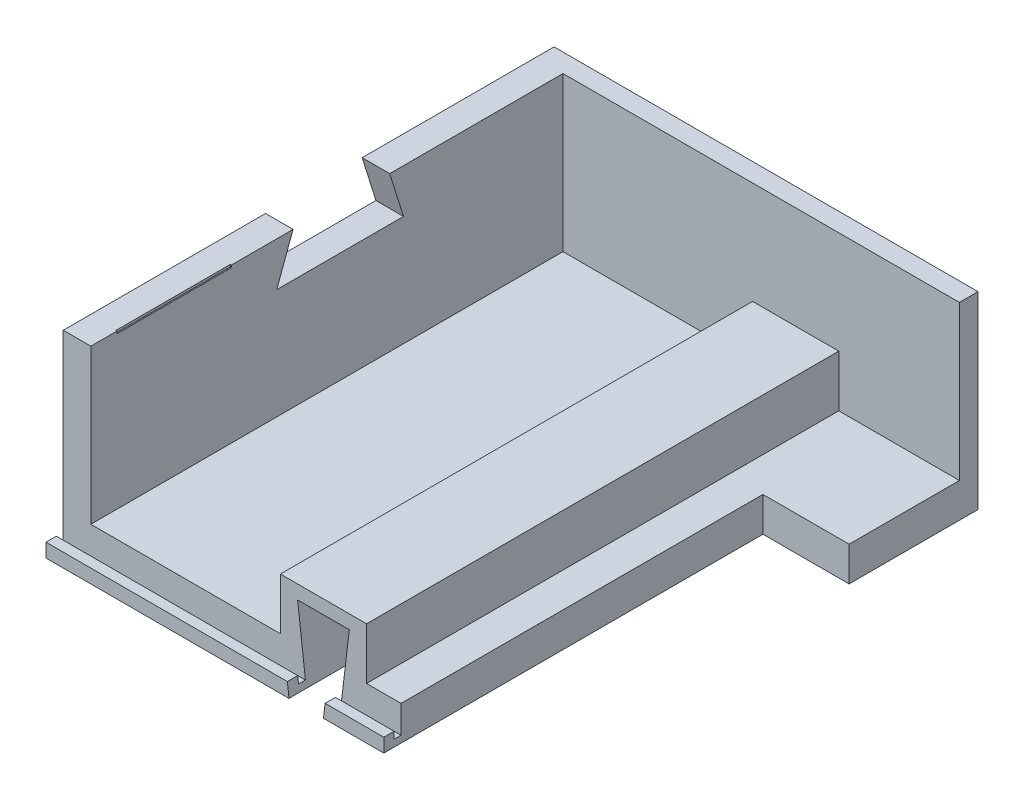
ISO-10303-21;
HEADER;
FILE_DESCRIPTION(('STEP AP214'),'2;1');
FILE_NAME('part.step','',(''),(''),'','','');
FILE_SCHEMA(('AUTOMOTIVE_DESIGN { 1 0 10303 214 1 1 1 1 }'));
ENDSEC;
DATA;
#1=APPLICATION_CONTEXT('core data for automotive mechanical design processes');
#2=APPLICATION_PROTOCOL_DEFINITION('international standard','automotive_design',2000,#1);
#3=PRODUCT_CONTEXT('',#1,'mechanical');
#4=PRODUCT('Part','Part','',(#3));
#5=PRODUCT_RELATED_PRODUCT_CATEGORY('part','',(#4));
#6=PRODUCT_DEFINITION_FORMATION('','',#4);
#7=PRODUCT_DEFINITION_CONTEXT('part definition',#1,'design');
#8=PRODUCT_DEFINITION('design','',#6,#7);
#9=PRODUCT_DEFINITION_SHAPE('','',#8);
#10=(LENGTH_UNIT() NAMED_UNIT(*) SI_UNIT(.MILLI.,.METRE.));
#11=(NAMED_UNIT(*) PLANE_ANGLE_UNIT() SI_UNIT($,.RADIAN.));
#12=(NAMED_UNIT(*) SI_UNIT($,.STERADIAN.) SOLID_ANGLE_UNIT());
#13=UNCERTAINTY_MEASURE_WITH_UNIT(LENGTH_MEASURE(1.E-05),#10,'distance_accuracy_value','');
#14=(GEOMETRIC_REPRESENTATION_CONTEXT(3) GLOBAL_UNCERTAINTY_ASSIGNED_CONTEXT((#13)) GLOBAL_UNIT_ASSIGNED_CONTEXT((#10,
#11,#12)) REPRESENTATION_CONTEXT('',''));
#15=CARTESIAN_POINT('',(0.,0.,0.));
#16=DIRECTION('',(0.,0.,1.));
#17=DIRECTION('',(1.,0.,0.));
#18=AXIS2_PLACEMENT_3D('',#15,#16,#17);
#19=CARTESIAN_POINT('',(21.4354854809113,-45.2491025304259,-73.0388494877858));
#20=DIRECTION('',(0.,-1.,0.));
#21=DIRECTION('',(1.,0.,0.));
#22=AXIS2_PLACEMENT_3D('',#19,#20,#21);
#23=PLANE('',#22);
#24=DIRECTION('',(-1.,0.,0.));
#25=VECTOR('',#24,1.);
#26=CARTESIAN_POINT('',(-125.,-45.2491025304259,-67.));
#27=LINE('',#26,#25);
#28=CARTESIAN_POINT('',(0.,-45.2491025304259,-67.));
#29=VERTEX_POINT('',#28);
#30=CARTESIAN_POINT('',(-115.,-45.2491025304259,-67.));
#31=VERTEX_POINT('',#30);
#32=EDGE_CURVE('E406',#29,#31,#27,.T.);
#33=ORIENTED_EDGE('',*,*,#32,.F.);
#34=DIRECTION('',(0.,0.,1.));
#35=VECTOR('',#34,1.);
#36=CARTESIAN_POINT('',(0.,-45.2491025304259,-81.3471847648053));
#37=LINE('',#36,#35);
#38=CARTESIAN_POINT('',(0.,-45.2491025304259,-72.4000000000001));
#39=VERTEX_POINT('',#38);
#40=EDGE_CURVE('E270',#39,#29,#37,.T.);
#41=ORIENTED_EDGE('',*,*,#40,.F.);
#42=DIRECTION('',(1.,0.,0.));
#43=VECTOR('',#42,1.);
#44=CARTESIAN_POINT('',(-265.,-45.2491025304259,-72.4000000000001));
#45=LINE('',#44,#43);
#46=CARTESIAN_POINT('',(-123.,-45.2491025304259,-72.4000000000001));
#47=VERTEX_POINT('',#46);
#48=EDGE_CURVE('E377',#47,#39,#45,.T.);
#49=ORIENTED_EDGE('',*,*,#48,.F.);
#50=DIRECTION('',(0.,0.,-1.));
#51=VECTOR('',#50,1.);
#52=CARTESIAN_POINT('',(-123.,-45.2491025304259,-313.));
#53=LINE('',#52,#51);
#54=CARTESIAN_POINT('',(-123.,-45.2491025304259,-16.7215392697663));
#55=VERTEX_POINT('',#54);
#56=EDGE_CURVE('E404',#55,#47,#53,.T.);
#57=ORIENTED_EDGE('',*,*,#56,.F.);
#58=DIRECTION('',(-1.,0.,0.));
#59=VECTOR('',#58,1.);
#60=CARTESIAN_POINT('',(21.4354854809113,-45.2491025304259,-16.7215392697663));
#61=LINE('',#60,#59);
#62=CARTESIAN_POINT('',(-115.,-45.2491025304259,-16.7215392697663));
#63=VERTEX_POINT('',#62);
#64=EDGE_CURVE('E414',#63,#55,#61,.T.);
#65=ORIENTED_EDGE('',*,*,#64,.F.);
#66=DIRECTION('',(0.,0.,1.));
#67=VECTOR('',#66,1.);
#68=CARTESIAN_POINT('',(-115.,-45.2491025304259,0.));
#69=LINE('',#68,#67);
#70=EDGE_CURVE('E421',#31,#63,#69,.T.);
#71=ORIENTED_EDGE('',*,*,#70,.F.);
#72=EDGE_LOOP('',(#33,#41,#49,#57,#65,#71));
#73=FACE_BOUND('',#72,.T.);
#74=ADVANCED_FACE('F35',(#73),#23,.F.);
#75=CARTESIAN_POINT('',(21.4354854809113,-45.2491025304259,11.3119662609812));
#76=DIRECTION('',(0.,-1.,0.));
#77=DIRECTION('',(1.,0.,0.));
#78=AXIS2_PLACEMENT_3D('',#75,#76,#77);
#79=PLANE('',#78);
#80=DIRECTION('',(-1.,0.,0.));
#81=VECTOR('',#80,1.);
#82=CARTESIAN_POINT('',(21.4354854809113,-45.2491025304259,11.3119662609812));
#83=LINE('',#82,#81);
#84=CARTESIAN_POINT('',(-115.,-45.2491025304259,11.3119662609812));
#85=VERTEX_POINT('',#84);
#86=CARTESIAN_POINT('',(-123.,-45.2491025304259,11.3119662609812));
#87=VERTEX_POINT('',#86);
#88=EDGE_CURVE('E11',#85,#87,#83,.T.);
#89=ORIENTED_EDGE('',*,*,#88,.T.);
#90=DIRECTION('',(0.,0.,-1.));
#91=VECTOR('',#90,1.);
#92=CARTESIAN_POINT('',(-123.,-45.2491025304259,-313.));
#93=LINE('',#92,#91);
#94=CARTESIAN_POINT('',(-123.,-45.2491025304259,70.));
#95=VERTEX_POINT('',#94);
#96=EDGE_CURVE('E51',#95,#87,#93,.T.);
#97=ORIENTED_EDGE('',*,*,#96,.F.);
#98=DIRECTION('',(-1.,0.,0.));
#99=VECTOR('',#98,1.);
#100=CARTESIAN_POINT('',(123.,-45.2491025304259,70.));
#101=LINE('',#100,#99);
#102=CARTESIAN_POINT('',(-115.,-45.2491025304259,70.));
#103=VERTEX_POINT('',#102);
#104=EDGE_CURVE('E407',#103,#95,#101,.T.);
#105=ORIENTED_EDGE('',*,*,#104,.F.);
#106=DIRECTION('',(0.,0.,1.));
#107=VECTOR('',#106,1.);
#108=CARTESIAN_POINT('',(-115.,-45.2491025304259,0.));
#109=LINE('',#108,#107);
#110=CARTESIAN_POINT('',(-115.,-45.2491025304259,62.3767432768174));
#111=VERTEX_POINT('',#110);
#112=EDGE_CURVE('E408',#111,#103,#109,.T.);
#113=ORIENTED_EDGE('',*,*,#112,.F.);
#114=DIRECTION('',(1.,0.,0.));
#115=VECTOR('',#114,1.);
#116=CARTESIAN_POINT('',(-115.313326688061,-45.2491025304259,62.3767432768174));
#117=LINE('',#116,#115);
#118=CARTESIAN_POINT('',(-115.313326688061,-45.2491025304259,62.3767432768174));
#119=VERTEX_POINT('',#118);
#120=EDGE_CURVE('E423',#119,#111,#117,.T.);
#121=ORIENTED_EDGE('',*,*,#120,.F.);
#122=DIRECTION('',(0.,0.,-1.));
#123=VECTOR('',#122,1.);
#124=CARTESIAN_POINT('',(-115.313326688061,-45.2491025304259,0.));
#125=LINE('',#124,#123);
#126=CARTESIAN_POINT('',(-115.313326688061,-45.2491025304259,29.2279597068515));
#127=VERTEX_POINT('',#126);
#128=EDGE_CURVE('E417',#119,#127,#125,.T.);
#129=ORIENTED_EDGE('',*,*,#128,.T.);
#130=DIRECTION('',(-1.,0.,0.));
#131=VECTOR('',#130,1.);
#132=CARTESIAN_POINT('',(-115.313326688061,-45.2491025304259,29.2279597068515));
#133=LINE('',#132,#131);
#134=CARTESIAN_POINT('',(-115.,-45.2491025304259,29.2279597068515));
#135=VERTEX_POINT('',#134);
#136=EDGE_CURVE('E419',#135,#127,#133,.T.);
#137=ORIENTED_EDGE('',*,*,#136,.F.);
#138=EDGE_CURVE('E424',#85,#135,#109,.T.);
#139=ORIENTED_EDGE('',*,*,#138,.F.);
#140=EDGE_LOOP('',(#89,#97,#105,#113,#121,#129,#137,#139));
#141=FACE_BOUND('',#140,.T.);
#142=ADVANCED_FACE('F457',(#141),#79,.F.);
#143=CARTESIAN_POINT('',(21.4354854809113,-58.014359513177,16.0676502349473));
#144=DIRECTION('',(0.,0.349109023172947,0.937082114832649));
#145=DIRECTION('',(0.,-0.93708211483265,0.349109023172947));
#146=AXIS2_PLACEMENT_3D('',#143,#144,#145);
#147=PLANE('',#146);
#148=DIRECTION('',(-1.,0.,0.));
#149=VECTOR('',#148,1.);
#150=CARTESIAN_POINT('',(21.4354854809113,-58.014359513177,16.0676502349473));
#151=LINE('',#150,#149);
#152=CARTESIAN_POINT('',(-115.,-58.014359513177,16.0676502349473));
#153=VERTEX_POINT('',#152);
#154=CARTESIAN_POINT('',(-123.,-58.014359513177,16.0676502349473));
#155=VERTEX_POINT('',#154);
#156=EDGE_CURVE('E43',#153,#155,#151,.T.);
#157=ORIENTED_EDGE('',*,*,#156,.T.);
#158=DIRECTION('',(0.,-0.937082114832649,0.349109023172947));
#159=VECTOR('',#158,1.);
#160=CARTESIAN_POINT('',(-123.,107.606809349563,-45.6343538511715));
#161=LINE('',#160,#159);
#162=EDGE_CURVE('E55',#87,#155,#161,.T.);
#163=ORIENTED_EDGE('',*,*,#162,.F.);
#164=ORIENTED_EDGE('',*,*,#88,.F.);
#165=DIRECTION('',(0.,0.93708211483265,-0.349109023172947));
#166=VECTOR('',#165,1.);
#167=CARTESIAN_POINT('',(-115.,-1.81418997521706,-4.86966782821422));
#168=LINE('',#167,#166);
#169=EDGE_CURVE('E426',#153,#85,#168,.T.);
#170=ORIENTED_EDGE('',*,*,#169,.F.);
#171=EDGE_LOOP('',(#157,#163,#164,#170));
#172=FACE_BOUND('',#171,.T.);
#173=ADVANCED_FACE('F449',(#172),#147,.F.);
#174=CARTESIAN_POINT('',(21.4354854809113,-58.014359513177,-20.7263257741588));
#175=DIRECTION('',(0.,-1.,0.));
#176=DIRECTION('',(1.,0.,0.));
#177=AXIS2_PLACEMENT_3D('',#174,#175,#176);
#178=PLANE('',#177);
#179=DIRECTION('',(-1.,0.,0.));
#180=VECTOR('',#179,1.);
#181=CARTESIAN_POINT('',(21.4354854809113,-58.014359513177,-20.7263257741588));
#182=LINE('',#181,#180);
#183=CARTESIAN_POINT('',(-115.,-58.014359513177,-20.7263257741588));
#184=VERTEX_POINT('',#183);
#185=CARTESIAN_POINT('',(-123.,-58.014359513177,-20.7263257741588));
#186=VERTEX_POINT('',#185);
#187=EDGE_CURVE('E411',#184,#186,#182,.T.);
#188=ORIENTED_EDGE('',*,*,#187,.T.);
#189=DIRECTION('',(0.,0.,-1.));
#190=VECTOR('',#189,1.);
#191=CARTESIAN_POINT('',(-123.,-58.014359513177,-313.));
#192=LINE('',#191,#190);
#193=EDGE_CURVE('E399',#155,#186,#192,.T.);
#194=ORIENTED_EDGE('',*,*,#193,.F.);
#195=ORIENTED_EDGE('',*,*,#156,.F.);
#196=DIRECTION('',(0.,0.,1.));
#197=VECTOR('',#196,1.);
#198=CARTESIAN_POINT('',(-115.,-58.014359513177,0.));
#199=LINE('',#198,#197);
#200=EDGE_CURVE('E432',#184,#153,#199,.T.);
#201=ORIENTED_EDGE('',*,*,#200,.F.);
#202=EDGE_LOOP('',(#188,#194,#195,#201));
#203=FACE_BOUND('',#202,.T.);
#204=ADVANCED_FACE('F447',(#203),#178,.F.);
#205=CARTESIAN_POINT('',(21.4354854809113,-45.2491025304259,-16.7215392697663));
#206=DIRECTION('',(0.,0.299340074537326,-0.954146487587723));
#207=DIRECTION('',(0.,0.954146487587723,0.299340074537326));
#208=AXIS2_PLACEMENT_3D('',#205,#206,#207);
#209=PLANE('',#208);
#210=ORIENTED_EDGE('',*,*,#64,.T.);
#211=DIRECTION('',(0.,0.954146487587723,0.299340074537326));
#212=VECTOR('',#211,1.);
#213=CARTESIAN_POINT('',(-123.,-81.3927176071615,-28.0607126271736));
#214=LINE('',#213,#212);
#215=EDGE_CURVE('E401',#186,#55,#214,.T.);
#216=ORIENTED_EDGE('',*,*,#215,.F.);
#217=ORIENTED_EDGE('',*,*,#187,.F.);
#218=DIRECTION('',(0.,-0.954146487587723,-0.299340074537326));
#219=VECTOR('',#218,1.);
#220=CARTESIAN_POINT('',(-115.,0.721388098123992,-2.29942456277022));
#221=LINE('',#220,#219);
#222=EDGE_CURVE('E38',#63,#184,#221,.T.);
#223=ORIENTED_EDGE('',*,*,#222,.F.);
#224=EDGE_LOOP('',(#210,#216,#217,#223));
#225=FACE_BOUND('',#224,.T.);
#226=ADVANCED_FACE('F444',(#225),#209,.F.);
#227=CARTESIAN_POINT('',(123.,0.,72.));
#228=DIRECTION('',(0.,0.,-1.));
#229=DIRECTION('',(-1.,0.,0.));
#230=AXIS2_PLACEMENT_3D('',#227,#228,#229);
#231=PLANE('',#230);
#232=DIRECTION('',(-1.,0.,0.));
#233=VECTOR('',#232,1.);
#234=CARTESIAN_POINT('',(123.,-96.,72.));
#235=LINE('',#234,#233);
#236=CARTESIAN_POINT('',(-25.,-96.,72.));
#237=VERTEX_POINT('',#236);
#238=CARTESIAN_POINT('',(-42.0238095238096,-96.,72.));
#239=VERTEX_POINT('',#238);
#240=EDGE_CURVE('E385',#237,#239,#235,.T.);
#241=ORIENTED_EDGE('',*,*,#240,.F.);
#242=DIRECTION('',(0.,-1.,0.));
#243=VECTOR('',#242,1.);
#244=CARTESIAN_POINT('',(-25.,-26.0000000000001,72.));
#245=LINE('',#244,#243);
#246=CARTESIAN_POINT('',(-25.,-98.,72.));
#247=VERTEX_POINT('',#246);
#248=EDGE_CURVE('E323',#237,#247,#245,.T.);
#249=ORIENTED_EDGE('',*,*,#248,.T.);
#250=DIRECTION('',(-1.,0.,0.));
#251=VECTOR('',#250,1.);
#252=CARTESIAN_POINT('',(123.,-98.,72.));
#253=LINE('',#252,#251);
#254=CARTESIAN_POINT('',(-42.2619047619048,-98.,72.));
#255=VERTEX_POINT('',#254);
#256=EDGE_CURVE('E364',#247,#255,#253,.T.);
#257=ORIENTED_EDGE('',*,*,#256,.T.);
#258=DIRECTION('',(-0.118212889785112,-0.992988274194944,0.));
#259=VECTOR('',#258,1.);
#260=CARTESIAN_POINT('',(-30.1676914477362,3.59139183901622,72.));
#261=LINE('',#260,#259);
#262=EDGE_CURVE('E318',#239,#255,#261,.T.);
#263=ORIENTED_EDGE('',*,*,#262,.F.);
#264=EDGE_LOOP('',(#241,#249,#257,#263));
#265=FACE_BOUND('',#264,.T.);
#266=ADVANCED_FACE('F568',(#265),#231,.T.);
#267=CARTESIAN_POINT('',(123.,-96.,0.));
#268=DIRECTION('',(0.,1.,0.));
#269=DIRECTION('',(-1.,0.,0.));
#270=AXIS2_PLACEMENT_3D('',#267,#268,#269);
#271=PLANE('',#270);
#272=DIRECTION('',(-1.,0.,0.));
#273=VECTOR('',#272,1.);
#274=CARTESIAN_POINT('',(123.,-96.,75.));
#275=LINE('',#274,#273);
#276=CARTESIAN_POINT('',(-25.,-96.,75.));
#277=VERTEX_POINT('',#276);
#278=CARTESIAN_POINT('',(-42.0238095238096,-96.,75.));
#279=VERTEX_POINT('',#278);
#280=EDGE_CURVE('E389',#277,#279,#275,.T.);
#281=ORIENTED_EDGE('',*,*,#280,.F.);
#282=DIRECTION('',(0.,0.,-1.));
#283=VECTOR('',#282,1.);
#284=CARTESIAN_POINT('',(-25.,-96.,35.));
#285=LINE('',#284,#283);
#286=EDGE_CURVE('E362',#277,#237,#285,.T.);
#287=ORIENTED_EDGE('',*,*,#286,.T.);
#288=ORIENTED_EDGE('',*,*,#240,.T.);
#289=DIRECTION('',(0.,0.,-1.));
#290=VECTOR('',#289,1.);
#291=CARTESIAN_POINT('',(-42.0238095238096,-96.,-67.));
#292=LINE('',#291,#290);
#293=EDGE_CURVE('E357',#279,#239,#292,.T.);
#294=ORIENTED_EDGE('',*,*,#293,.F.);
#295=EDGE_LOOP('',(#281,#287,#288,#294));
#296=FACE_BOUND('',#295,.T.);
#297=ADVANCED_FACE('F572',(#296),#271,.T.);
#298=CARTESIAN_POINT('',(-125.,-100.,-67.));
#299=DIRECTION('',(0.,0.,-1.));
#300=DIRECTION('',(-1.,0.,0.));
#301=AXIS2_PLACEMENT_3D('',#298,#299,#300);
#302=PLANE('',#301);
#303=DIRECTION('',(-1.,0.,0.));
#304=VECTOR('',#303,1.);
#305=CARTESIAN_POINT('',(-125.,-100.,-67.));
#306=LINE('',#305,#304);
#307=CARTESIAN_POINT('',(-42.5000000000001,-100.,-67.));
#308=VERTEX_POINT('',#307);
#309=CARTESIAN_POINT('',(-52.5000000000001,-100.,-67.));
#310=VERTEX_POINT('',#309);
#311=EDGE_CURVE('E473',#308,#310,#306,.T.);
#312=ORIENTED_EDGE('',*,*,#311,.F.);
#313=DIRECTION('',(-0.118212889785112,-0.992988274194944,0.));
#314=VECTOR('',#313,1.);
#315=CARTESIAN_POINT('',(-30.1676914477362,3.59139183901622,-67.));
#316=LINE('',#315,#314);
#317=CARTESIAN_POINT('',(-40.0000000000001,-79.,-67.));
#318=VERTEX_POINT('',#317);
#319=EDGE_CURVE('E484',#318,#308,#316,.T.);
#320=ORIENTED_EDGE('',*,*,#319,.F.);
#321=DIRECTION('',(1.,0.,0.));
#322=VECTOR('',#321,1.);
#323=CARTESIAN_POINT('',(0.,-79.,-67.));
#324=LINE('',#323,#322);
#325=CARTESIAN_POINT('',(-55.0000000000001,-79.,-67.));
#326=VERTEX_POINT('',#325);
#327=EDGE_CURVE('E512',#326,#318,#324,.T.);
#328=ORIENTED_EDGE('',*,*,#327,.F.);
#329=DIRECTION('',(0.118212889785112,-0.992988274194944,0.));
#330=VECTOR('',#329,1.);
#331=CARTESIAN_POINT('',(-63.5047512576859,-7.5600894354388,-67.));
#332=LINE('',#331,#330);
#333=EDGE_CURVE('E515',#326,#310,#332,.T.);
#334=ORIENTED_EDGE('',*,*,#333,.T.);
#335=EDGE_LOOP('',(#312,#320,#328,#334));
#336=FACE_BOUND('',#335,.T.);
#337=ADVANCED_FACE('F578',(#336),#302,.F.);
#338=CARTESIAN_POINT('',(-125.,8.,75.));
#339=DIRECTION('',(0.,0.,-1.));
#340=DIRECTION('',(-1.,0.,0.));
#341=AXIS2_PLACEMENT_3D('',#338,#339,#340);
#342=PLANE('',#341);
#343=ORIENTED_EDGE('',*,*,#280,.T.);
#344=DIRECTION('',(-0.118212889785112,-0.992988274194944,0.));
#345=VECTOR('',#344,1.);
#346=CARTESIAN_POINT('',(-30.1676914477362,3.59139183901622,75.));
#347=LINE('',#346,#345);
#348=CARTESIAN_POINT('',(-42.5000000000001,-100.,75.));
#349=VERTEX_POINT('',#348);
#350=EDGE_CURVE('E282',#279,#349,#347,.T.);
#351=ORIENTED_EDGE('',*,*,#350,.T.);
#352=DIRECTION('',(1.,0.,0.));
#353=VECTOR('',#352,1.);
#354=CARTESIAN_POINT('',(0.,-100.,75.));
#355=LINE('',#354,#353);
#356=CARTESIAN_POINT('',(-25.,-100.,75.));
#357=VERTEX_POINT('',#356);
#358=EDGE_CURVE('E279',#349,#357,#355,.T.);
#359=ORIENTED_EDGE('',*,*,#358,.T.);
#360=DIRECTION('',(0.,-1.,0.));
#361=VECTOR('',#360,1.);
#362=CARTESIAN_POINT('',(-25.,-76.0000000000001,75.));
#363=LINE('',#362,#361);
#364=EDGE_CURVE('E303',#277,#357,#363,.T.);
#365=ORIENTED_EDGE('',*,*,#364,.F.);
#366=EDGE_LOOP('',(#343,#351,#359,#365));
#367=FACE_BOUND('',#366,.T.);
#368=ADVANCED_FACE('F583',(#367),#342,.F.);
#369=CARTESIAN_POINT('',(-25.,-26.0000000000001,-35.));
#370=DIRECTION('',(0.,0.,-1.));
#371=DIRECTION('',(-1.,0.,0.));
#372=AXIS2_PLACEMENT_3D('',#369,#370,#371);
#373=PLANE('',#372);
#374=DIRECTION('',(1.,0.,0.));
#375=VECTOR('',#374,1.);
#376=CARTESIAN_POINT('',(-25.,-100.,-35.));
#377=LINE('',#376,#375);
#378=CARTESIAN_POINT('',(-25.,-100.,-35.));
#379=VERTEX_POINT('',#378);
#380=CARTESIAN_POINT('',(0.,-100.,-35.));
#381=VERTEX_POINT('',#380);
#382=EDGE_CURVE('E290',#379,#381,#377,.T.);
#383=ORIENTED_EDGE('',*,*,#382,.T.);
#384=DIRECTION('',(0.,1.,0.));
#385=VECTOR('',#384,1.);
#386=CARTESIAN_POINT('',(0.,-26.0000000000001,-35.));
#387=LINE('',#386,#385);
#388=CARTESIAN_POINT('',(0.,-90.,-35.));
#389=VERTEX_POINT('',#388);
#390=EDGE_CURVE('E262',#381,#389,#387,.T.);
#391=ORIENTED_EDGE('',*,*,#390,.T.);
#392=DIRECTION('',(1.,0.,0.));
#393=VECTOR('',#392,1.);
#394=CARTESIAN_POINT('',(0.,-90.,-35.));
#395=LINE('',#394,#393);
#396=CARTESIAN_POINT('',(-25.,-90.,-35.));
#397=VERTEX_POINT('',#396);
#398=EDGE_CURVE('E259',#397,#389,#395,.T.);
#399=ORIENTED_EDGE('',*,*,#398,.F.);
#400=DIRECTION('',(0.,-1.,0.));
#401=VECTOR('',#400,1.);
#402=CARTESIAN_POINT('',(-25.,-26.0000000000001,-35.));
#403=LINE('',#402,#401);
#404=EDGE_CURVE('E288',#397,#379,#403,.T.);
#405=ORIENTED_EDGE('',*,*,#404,.T.);
#406=EDGE_LOOP('',(#383,#391,#399,#405));
#407=FACE_BOUND('',#406,.T.);
#408=ADVANCED_FACE('F589',(#407),#373,.F.);
#409=CARTESIAN_POINT('',(-115.313326688061,0.,0.));
#410=DIRECTION('',(1.,0.,0.));
#411=DIRECTION('',(0.,0.,-1.));
#412=AXIS2_PLACEMENT_3D('',#409,#410,#411);
#413=PLANE('',#412);
#414=ORIENTED_EDGE('',*,*,#128,.F.);
#415=DIRECTION('',(0.,-1.,0.));
#416=VECTOR('',#415,1.);
#417=CARTESIAN_POINT('',(-115.313326688061,-27.1978673837026,62.3767432768174));
#418=LINE('',#417,#416);
#419=CARTESIAN_POINT('',(-115.313326688061,-45.9108903667479,62.3767432768174));
#420=VERTEX_POINT('',#419);
#421=EDGE_CURVE('E316',#119,#420,#418,.T.);
#422=ORIENTED_EDGE('',*,*,#421,.T.);
#423=DIRECTION('',(0.,0.,-1.));
#424=VECTOR('',#423,1.);
#425=CARTESIAN_POINT('',(-115.313326688061,-45.9108903667479,62.3767432768174));
#426=LINE('',#425,#424);
#427=CARTESIAN_POINT('',(-115.313326688061,-45.9108903667479,29.2279597068515));
#428=VERTEX_POINT('',#427);
#429=EDGE_CURVE('E313',#420,#428,#426,.T.);
#430=ORIENTED_EDGE('',*,*,#429,.T.);
#431=DIRECTION('',(0.,1.,0.));
#432=VECTOR('',#431,1.);
#433=CARTESIAN_POINT('',(-115.313326688061,-27.1978673837026,29.2279597068515));
#434=LINE('',#433,#432);
#435=EDGE_CURVE('E308',#428,#127,#434,.T.);
#436=ORIENTED_EDGE('',*,*,#435,.T.);
#437=EDGE_LOOP('',(#414,#422,#430,#436));
#438=FACE_BOUND('',#437,.T.);
#439=ADVANCED_FACE('F659',(#438),#413,.T.);
#440=CARTESIAN_POINT('',(-115.313326688061,-27.1978673837026,62.3767432768174));
#441=DIRECTION('',(0.,0.,1.));
#442=DIRECTION('',(1.,0.,0.));
#443=AXIS2_PLACEMENT_3D('',#440,#441,#442);
#444=PLANE('',#443);
#445=ORIENTED_EDGE('',*,*,#421,.F.);
#446=ORIENTED_EDGE('',*,*,#120,.T.);
#447=DIRECTION('',(0.,1.,0.));
#448=VECTOR('',#447,1.);
#449=CARTESIAN_POINT('',(-115.,0.,62.3767432768174));
#450=LINE('',#449,#448);
#451=CARTESIAN_POINT('',(-115.,-45.9108903667479,62.3767432768174));
#452=VERTEX_POINT('',#451);
#453=EDGE_CURVE('E463',#452,#111,#450,.T.);
#454=ORIENTED_EDGE('',*,*,#453,.F.);
#455=DIRECTION('',(1.,0.,0.));
#456=VECTOR('',#455,1.);
#457=CARTESIAN_POINT('',(-115.313326688061,-45.9108903667479,62.3767432768174));
#458=LINE('',#457,#456);
#459=EDGE_CURVE('E306',#420,#452,#458,.T.);
#460=ORIENTED_EDGE('',*,*,#459,.F.);
#461=EDGE_LOOP('',(#445,#446,#454,#460));
#462=FACE_BOUND('',#461,.T.);
#463=ADVANCED_FACE('F656',(#462),#444,.F.);
#464=CARTESIAN_POINT('',(-115.313326688061,-45.9108903667479,62.3767432768174));
#465=DIRECTION('',(0.,-1.,0.));
#466=DIRECTION('',(0.,0.,-1.));
#467=AXIS2_PLACEMENT_3D('',#464,#465,#466);
#468=PLANE('',#467);
#469=DIRECTION('',(1.,0.,0.));
#470=VECTOR('',#469,1.);
#471=CARTESIAN_POINT('',(-115.313326688061,-45.9108903667479,29.2279597068515));
#472=LINE('',#471,#470);
#473=CARTESIAN_POINT('',(-115.,-45.9108903667479,29.2279597068515));
#474=VERTEX_POINT('',#473);
#475=EDGE_CURVE('E305',#428,#474,#472,.T.);
#476=ORIENTED_EDGE('',*,*,#475,.F.);
#477=ORIENTED_EDGE('',*,*,#429,.F.);
#478=ORIENTED_EDGE('',*,*,#459,.T.);
#479=DIRECTION('',(0.,0.,1.));
#480=VECTOR('',#479,1.);
#481=CARTESIAN_POINT('',(-115.,-45.9108903667479,0.));
#482=LINE('',#481,#480);
#483=EDGE_CURVE('E462',#474,#452,#482,.T.);
#484=ORIENTED_EDGE('',*,*,#483,.F.);
#485=EDGE_LOOP('',(#476,#477,#478,#484));
#486=FACE_BOUND('',#485,.T.);
#487=ADVANCED_FACE('F661',(#486),#468,.F.);
#488=CARTESIAN_POINT('',(-115.313326688061,-27.1978673837026,29.2279597068515));
#489=DIRECTION('',(0.,0.,-1.));
#490=DIRECTION('',(-1.,0.,0.));
#491=AXIS2_PLACEMENT_3D('',#488,#489,#490);
#492=PLANE('',#491);
#493=DIRECTION('',(0.,-1.,0.));
#494=VECTOR('',#493,1.);
#495=CARTESIAN_POINT('',(-115.,0.,29.2279597068515));
#496=LINE('',#495,#494);
#497=EDGE_CURVE('E454',#135,#474,#496,.T.);
#498=ORIENTED_EDGE('',*,*,#497,.F.);
#499=ORIENTED_EDGE('',*,*,#136,.T.);
#500=ORIENTED_EDGE('',*,*,#435,.F.);
#501=ORIENTED_EDGE('',*,*,#475,.T.);
#502=EDGE_LOOP('',(#498,#499,#500,#501));
#503=FACE_BOUND('',#502,.T.);
#504=ADVANCED_FACE('F461',(#503),#492,.F.);
#505=CARTESIAN_POINT('',(-25.,-26.0000000000001,35.));
#506=DIRECTION('',(-1.,0.,0.));
#507=DIRECTION('',(0.,0.,1.));
#508=AXIS2_PLACEMENT_3D('',#505,#506,#507);
#509=PLANE('',#508);
#510=DIRECTION('',(0.,0.,-1.));
#511=VECTOR('',#510,1.);
#512=CARTESIAN_POINT('',(-25.,-90.,-67.));
#513=LINE('',#512,#511);
#514=CARTESIAN_POINT('',(-25.,-90.,70.));
#515=VERTEX_POINT('',#514);
#516=EDGE_CURVE('E379',#515,#397,#513,.T.);
#517=ORIENTED_EDGE('',*,*,#516,.F.);
#518=DIRECTION('',(0.,-1.,0.));
#519=VECTOR('',#518,1.);
#520=CARTESIAN_POINT('',(-25.,-26.0000000000001,70.));
#521=LINE('',#520,#519);
#522=CARTESIAN_POINT('',(-25.,-98.,70.));
#523=VERTEX_POINT('',#522);
#524=EDGE_CURVE('E354',#515,#523,#521,.T.);
#525=ORIENTED_EDGE('',*,*,#524,.T.);
#526=DIRECTION('',(0.,0.,-1.));
#527=VECTOR('',#526,1.);
#528=CARTESIAN_POINT('',(-25.,-98.,35.));
#529=LINE('',#528,#527);
#530=EDGE_CURVE('E330',#247,#523,#529,.T.);
#531=ORIENTED_EDGE('',*,*,#530,.F.);
#532=ORIENTED_EDGE('',*,*,#248,.F.);
#533=ORIENTED_EDGE('',*,*,#286,.F.);
#534=ORIENTED_EDGE('',*,*,#364,.T.);
#535=DIRECTION('',(0.,0.,-1.));
#536=VECTOR('',#535,1.);
#537=CARTESIAN_POINT('',(-25.,-100.,35.));
#538=LINE('',#537,#536);
#539=EDGE_CURVE('E292',#357,#379,#538,.T.);
#540=ORIENTED_EDGE('',*,*,#539,.T.);
#541=ORIENTED_EDGE('',*,*,#404,.F.);
#542=EDGE_LOOP('',(#517,#525,#531,#532,#533,#534,#540,#541));
#543=FACE_BOUND('',#542,.T.);
#544=ADVANCED_FACE('F636',(#543),#509,.F.);
#545=CARTESIAN_POINT('',(123.,-98.,0.));
#546=DIRECTION('',(0.,1.,0.));
#547=DIRECTION('',(-1.,0.,0.));
#548=AXIS2_PLACEMENT_3D('',#545,#546,#547);
#549=PLANE('',#548);
#550=ORIENTED_EDGE('',*,*,#256,.F.);
#551=ORIENTED_EDGE('',*,*,#530,.T.);
#552=DIRECTION('',(-1.,0.,0.));
#553=VECTOR('',#552,1.);
#554=CARTESIAN_POINT('',(123.,-98.,70.));
#555=LINE('',#554,#553);
#556=CARTESIAN_POINT('',(-42.2619047619048,-98.,70.));
#557=VERTEX_POINT('',#556);
#558=EDGE_CURVE('E393',#523,#557,#555,.T.);
#559=ORIENTED_EDGE('',*,*,#558,.T.);
#560=DIRECTION('',(0.,0.,-1.));
#561=VECTOR('',#560,1.);
#562=CARTESIAN_POINT('',(-42.2619047619048,-98.,-67.));
#563=LINE('',#562,#561);
#564=EDGE_CURVE('E325',#255,#557,#563,.T.);
#565=ORIENTED_EDGE('',*,*,#564,.F.);
#566=EDGE_LOOP('',(#550,#551,#559,#565));
#567=FACE_BOUND('',#566,.T.);
#568=ADVANCED_FACE('F640',(#567),#549,.T.);
#569=CARTESIAN_POINT('',(-30.1676914477362,3.59139183901622,-67.));
#570=DIRECTION('',(-0.992988274194944,0.118212889785112,0.));
#571=DIRECTION('',(-0.118212889785112,-0.992988274194944,0.));
#572=AXIS2_PLACEMENT_3D('',#569,#570,#571);
#573=PLANE('',#572);
#574=DIRECTION('',(-0.118212889785112,-0.992988274194944,0.));
#575=VECTOR('',#574,1.);
#576=CARTESIAN_POINT('',(-30.1676914477362,3.59139183901624,70.));
#577=LINE('',#576,#575);
#578=CARTESIAN_POINT('',(-40.0000000000001,-79.,70.));
#579=VERTEX_POINT('',#578);
#580=EDGE_CURVE('E332',#579,#557,#577,.T.);
#581=ORIENTED_EDGE('',*,*,#580,.F.);
#582=DIRECTION('',(0.,0.,1.));
#583=VECTOR('',#582,1.);
#584=CARTESIAN_POINT('',(-40.0000000000001,-79.,-67.));
#585=LINE('',#584,#583);
#586=EDGE_CURVE('E503',#318,#579,#585,.T.);
#587=ORIENTED_EDGE('',*,*,#586,.F.);
#588=ORIENTED_EDGE('',*,*,#319,.T.);
#589=DIRECTION('',(0.,0.,1.));
#590=VECTOR('',#589,1.);
#591=CARTESIAN_POINT('',(-42.5000000000001,-100.,-67.));
#592=LINE('',#591,#590);
#593=EDGE_CURVE('E481',#308,#349,#592,.T.);
#594=ORIENTED_EDGE('',*,*,#593,.T.);
#595=ORIENTED_EDGE('',*,*,#350,.F.);
#596=ORIENTED_EDGE('',*,*,#293,.T.);
#597=ORIENTED_EDGE('',*,*,#262,.T.);
#598=ORIENTED_EDGE('',*,*,#564,.T.);
#599=EDGE_LOOP('',(#581,#587,#588,#594,#595,#596,#597,#598));
#600=FACE_BOUND('',#599,.T.);
#601=ADVANCED_FACE('F605',(#600),#573,.T.);
#602=CARTESIAN_POINT('',(0.,-79.,-67.));
#603=DIRECTION('',(0.,-1.,0.));
#604=DIRECTION('',(0.,0.,-1.));
#605=AXIS2_PLACEMENT_3D('',#602,#603,#604);
#606=PLANE('',#605);
#607=DIRECTION('',(1.,0.,0.));
#608=VECTOR('',#607,1.);
#609=CARTESIAN_POINT('',(0.,-79.,70.));
#610=LINE('',#609,#608);
#611=CARTESIAN_POINT('',(-55.,-78.9999999999999,70.));
#612=VERTEX_POINT('',#611);
#613=EDGE_CURVE('E334',#612,#579,#610,.T.);
#614=ORIENTED_EDGE('',*,*,#613,.F.);
#615=DIRECTION('',(0.,0.,1.));
#616=VECTOR('',#615,1.);
#617=CARTESIAN_POINT('',(-55.0000000000001,-79.,-67.));
#618=LINE('',#617,#616);
#619=EDGE_CURVE('E500',#326,#612,#618,.T.);
#620=ORIENTED_EDGE('',*,*,#619,.F.);
#621=ORIENTED_EDGE('',*,*,#327,.T.);
#622=ORIENTED_EDGE('',*,*,#586,.T.);
#623=EDGE_LOOP('',(#614,#620,#621,#622));
#624=FACE_BOUND('',#623,.T.);
#625=ADVANCED_FACE('F608',(#624),#606,.T.);
#626=CARTESIAN_POINT('',(-63.5047512576859,-7.5600894354388,-67.));
#627=DIRECTION('',(-0.992988274194944,-0.118212889785112,0.));
#628=DIRECTION('',(0.118212889785112,-0.992988274194944,0.));
#629=AXIS2_PLACEMENT_3D('',#626,#627,#628);
#630=PLANE('',#629);
#631=ORIENTED_EDGE('',*,*,#619,.T.);
#632=DIRECTION('',(0.118212889785112,-0.992988274194944,0.));
#633=VECTOR('',#632,1.);
#634=CARTESIAN_POINT('',(-63.5047512576859,-7.56008943543879,70.));
#635=LINE('',#634,#633);
#636=CARTESIAN_POINT('',(-52.7380952380953,-98.,70.));
#637=VERTEX_POINT('',#636);
#638=EDGE_CURVE('E336',#612,#637,#635,.T.);
#639=ORIENTED_EDGE('',*,*,#638,.T.);
#640=DIRECTION('',(0.,0.,-1.));
#641=VECTOR('',#640,1.);
#642=CARTESIAN_POINT('',(-52.7380952380953,-98.,-67.));
#643=LINE('',#642,#641);
#644=CARTESIAN_POINT('',(-52.7380952380953,-98.,72.));
#645=VERTEX_POINT('',#644);
#646=EDGE_CURVE('E328',#645,#637,#643,.T.);
#647=ORIENTED_EDGE('',*,*,#646,.F.);
#648=DIRECTION('',(0.118212889785112,-0.992988274194944,0.));
#649=VECTOR('',#648,1.);
#650=CARTESIAN_POINT('',(-63.5047512576859,-7.5600894354388,72.));
#651=LINE('',#650,#649);
#652=CARTESIAN_POINT('',(-52.9761904761905,-96.,72.));
#653=VERTEX_POINT('',#652);
#654=EDGE_CURVE('E321',#653,#645,#651,.T.);
#655=ORIENTED_EDGE('',*,*,#654,.F.);
#656=DIRECTION('',(0.,0.,-1.));
#657=VECTOR('',#656,1.);
#658=CARTESIAN_POINT('',(-52.9761904761905,-96.,-67.));
#659=LINE('',#658,#657);
#660=CARTESIAN_POINT('',(-52.9761904761905,-96.,75.));
#661=VERTEX_POINT('',#660);
#662=EDGE_CURVE('E360',#661,#653,#659,.T.);
#663=ORIENTED_EDGE('',*,*,#662,.F.);
#664=DIRECTION('',(0.118212889785112,-0.992988274194944,0.));
#665=VECTOR('',#664,1.);
#666=CARTESIAN_POINT('',(-63.5047512576859,-7.5600894354388,75.));
#667=LINE('',#666,#665);
#668=CARTESIAN_POINT('',(-52.5000000000001,-100.,75.));
#669=VERTEX_POINT('',#668);
#670=EDGE_CURVE('E291',#661,#669,#667,.T.);
#671=ORIENTED_EDGE('',*,*,#670,.T.);
#672=DIRECTION('',(0.,0.,1.));
#673=VECTOR('',#672,1.);
#674=CARTESIAN_POINT('',(-52.5000000000001,-100.,-67.));
#675=LINE('',#674,#673);
#676=EDGE_CURVE('E497',#310,#669,#675,.T.);
#677=ORIENTED_EDGE('',*,*,#676,.F.);
#678=ORIENTED_EDGE('',*,*,#333,.F.);
#679=EDGE_LOOP('',(#631,#639,#647,#655,#663,#671,#677,#678));
#680=FACE_BOUND('',#679,.T.);
#681=ADVANCED_FACE('F610',(#680),#630,.F.);
#682=CARTESIAN_POINT('',(0.,-90.,-67.));
#683=DIRECTION('',(0.,-1.,0.));
#684=DIRECTION('',(1.,0.,0.));
#685=AXIS2_PLACEMENT_3D('',#682,#683,#684);
#686=PLANE('',#685);
#687=ORIENTED_EDGE('',*,*,#398,.T.);
#688=DIRECTION('',(0.,0.,-1.));
#689=VECTOR('',#688,1.);
#690=CARTESIAN_POINT('',(0.,-90.,-67.));
#691=LINE('',#690,#689);
#692=CARTESIAN_POINT('',(0.,-90.,-67.));
#693=VERTEX_POINT('',#692);
#694=EDGE_CURVE('E251',#389,#693,#691,.T.);
#695=ORIENTED_EDGE('',*,*,#694,.T.);
#696=DIRECTION('',(1.,0.,0.));
#697=VECTOR('',#696,1.);
#698=CARTESIAN_POINT('',(0.,-90.,-67.));
#699=LINE('',#698,#697);
#700=CARTESIAN_POINT('',(-35.0000000000001,-90.,-67.));
#701=VERTEX_POINT('',#700);
#702=EDGE_CURVE('E256',#701,#693,#699,.T.);
#703=ORIENTED_EDGE('',*,*,#702,.F.);
#704=DIRECTION('',(0.,0.,1.));
#705=VECTOR('',#704,1.);
#706=CARTESIAN_POINT('',(-35.0000000000001,-90.,-67.));
#707=LINE('',#706,#705);
#708=CARTESIAN_POINT('',(-35.0000000000001,-90.,70.));
#709=VERTEX_POINT('',#708);
#710=EDGE_CURVE('E482',#701,#709,#707,.T.);
#711=ORIENTED_EDGE('',*,*,#710,.T.);
#712=DIRECTION('',(1.,0.,0.));
#713=VECTOR('',#712,1.);
#714=CARTESIAN_POINT('',(0.,-90.,70.));
#715=LINE('',#714,#713);
#716=EDGE_CURVE('E351',#709,#515,#715,.T.);
#717=ORIENTED_EDGE('',*,*,#716,.T.);
#718=ORIENTED_EDGE('',*,*,#516,.T.);
#719=EDGE_LOOP('',(#687,#695,#703,#711,#717,#718));
#720=FACE_BOUND('',#719,.T.);
#721=ADVANCED_FACE('F253',(#720),#686,.F.);
#722=CARTESIAN_POINT('',(-35.0000000000001,0.,-67.));
#723=DIRECTION('',(1.,0.,0.));
#724=DIRECTION('',(0.,0.,-1.));
#725=AXIS2_PLACEMENT_3D('',#722,#723,#724);
#726=PLANE('',#725);
#727=DIRECTION('',(0.,1.,0.));
#728=VECTOR('',#727,1.);
#729=CARTESIAN_POINT('',(-35.0000000000001,0.,70.));
#730=LINE('',#729,#728);
#731=CARTESIAN_POINT('',(-35.0000000000001,-75.,70.));
#732=VERTEX_POINT('',#731);
#733=EDGE_CURVE('E349',#709,#732,#730,.T.);
#734=ORIENTED_EDGE('',*,*,#733,.F.);
#735=ORIENTED_EDGE('',*,*,#710,.F.);
#736=DIRECTION('',(0.,1.,0.));
#737=VECTOR('',#736,1.);
#738=CARTESIAN_POINT('',(-35.0000000000001,0.,-67.));
#739=LINE('',#738,#737);
#740=CARTESIAN_POINT('',(-35.0000000000001,-75.,-67.));
#741=VERTEX_POINT('',#740);
#742=EDGE_CURVE('E278',#701,#741,#739,.T.);
#743=ORIENTED_EDGE('',*,*,#742,.T.);
#744=DIRECTION('',(0.,0.,1.));
#745=VECTOR('',#744,1.);
#746=CARTESIAN_POINT('',(-35.0000000000001,-75.,-67.));
#747=LINE('',#746,#745);
#748=EDGE_CURVE('E485',#741,#732,#747,.T.);
#749=ORIENTED_EDGE('',*,*,#748,.T.);
#750=EDGE_LOOP('',(#734,#735,#743,#749));
#751=FACE_BOUND('',#750,.T.);
#752=ADVANCED_FACE('F677',(#751),#726,.T.);
#753=CARTESIAN_POINT('',(0.,-75.,-67.));
#754=DIRECTION('',(0.,1.,0.));
#755=DIRECTION('',(-1.,0.,0.));
#756=AXIS2_PLACEMENT_3D('',#753,#754,#755);
#757=PLANE('',#756);
#758=DIRECTION('',(-1.,0.,0.));
#759=VECTOR('',#758,1.);
#760=CARTESIAN_POINT('',(0.,-75.,70.));
#761=LINE('',#760,#759);
#762=CARTESIAN_POINT('',(-60.0000000000001,-75.,70.));
#763=VERTEX_POINT('',#762);
#764=EDGE_CURVE('E347',#732,#763,#761,.T.);
#765=ORIENTED_EDGE('',*,*,#764,.F.);
#766=ORIENTED_EDGE('',*,*,#748,.F.);
#767=DIRECTION('',(-1.,0.,0.));
#768=VECTOR('',#767,1.);
#769=CARTESIAN_POINT('',(0.,-75.,-67.));
#770=LINE('',#769,#768);
#771=CARTESIAN_POINT('',(-60.0000000000001,-75.,-67.));
#772=VERTEX_POINT('',#771);
#773=EDGE_CURVE('E284',#741,#772,#770,.T.);
#774=ORIENTED_EDGE('',*,*,#773,.T.);
#775=DIRECTION('',(0.,0.,1.));
#776=VECTOR('',#775,1.);
#777=CARTESIAN_POINT('',(-60.0000000000001,-75.,-67.));
#778=LINE('',#777,#776);
#779=EDGE_CURVE('E488',#772,#763,#778,.T.);
#780=ORIENTED_EDGE('',*,*,#779,.T.);
#781=EDGE_LOOP('',(#765,#766,#774,#780));
#782=FACE_BOUND('',#781,.T.);
#783=ADVANCED_FACE('F526',(#782),#757,.T.);
#784=CARTESIAN_POINT('',(-60.0000000000001,0.,-67.));
#785=DIRECTION('',(1.,0.,0.));
#786=DIRECTION('',(0.,0.,-1.));
#787=AXIS2_PLACEMENT_3D('',#784,#785,#786);
#788=PLANE('',#787);
#789=DIRECTION('',(0.,0.,1.));
#790=VECTOR('',#789,1.);
#791=CARTESIAN_POINT('',(-60.0000000000001,-90.,-67.));
#792=LINE('',#791,#790);
#793=CARTESIAN_POINT('',(-60.0000000000001,-90.,-67.));
#794=VERTEX_POINT('',#793);
#795=CARTESIAN_POINT('',(-60.0000000000001,-90.,70.));
#796=VERTEX_POINT('',#795);
#797=EDGE_CURVE('E491',#794,#796,#792,.T.);
#798=ORIENTED_EDGE('',*,*,#797,.T.);
#799=DIRECTION('',(0.,1.,0.));
#800=VECTOR('',#799,1.);
#801=CARTESIAN_POINT('',(-60.0000000000001,0.,70.));
#802=LINE('',#801,#800);
#803=EDGE_CURVE('E344',#796,#763,#802,.T.);
#804=ORIENTED_EDGE('',*,*,#803,.T.);
#805=ORIENTED_EDGE('',*,*,#779,.F.);
#806=DIRECTION('',(0.,1.,0.));
#807=VECTOR('',#806,1.);
#808=CARTESIAN_POINT('',(-60.0000000000001,0.,-67.));
#809=LINE('',#808,#807);
#810=EDGE_CURVE('E521',#794,#772,#809,.T.);
#811=ORIENTED_EDGE('',*,*,#810,.F.);
#812=EDGE_LOOP('',(#798,#804,#805,#811));
#813=FACE_BOUND('',#812,.T.);
#814=ADVANCED_FACE('F530',(#813),#788,.F.);
#815=CARTESIAN_POINT('',(0.,-89.9999999999999,-67.));
#816=DIRECTION('',(0.,-1.,0.));
#817=DIRECTION('',(1.,0.,0.));
#818=AXIS2_PLACEMENT_3D('',#815,#816,#817);
#819=PLANE('',#818);
#820=DIRECTION('',(0.,0.,1.));
#821=VECTOR('',#820,1.);
#822=CARTESIAN_POINT('',(-115.,-90.,-67.));
#823=LINE('',#822,#821);
#824=CARTESIAN_POINT('',(-115.,-90.,-67.));
#825=VERTEX_POINT('',#824);
#826=CARTESIAN_POINT('',(-115.,-90.,70.));
#827=VERTEX_POINT('',#826);
#828=EDGE_CURVE('E494',#825,#827,#823,.T.);
#829=ORIENTED_EDGE('',*,*,#828,.T.);
#830=DIRECTION('',(1.,0.,0.));
#831=VECTOR('',#830,1.);
#832=CARTESIAN_POINT('',(0.,-89.9999999999999,70.));
#833=LINE('',#832,#831);
#834=EDGE_CURVE('E341',#827,#796,#833,.T.);
#835=ORIENTED_EDGE('',*,*,#834,.T.);
#836=ORIENTED_EDGE('',*,*,#797,.F.);
#837=DIRECTION('',(1.,0.,0.));
#838=VECTOR('',#837,1.);
#839=CARTESIAN_POINT('',(0.,-89.9999999999999,-67.));
#840=LINE('',#839,#838);
#841=EDGE_CURVE('E518',#825,#794,#840,.T.);
#842=ORIENTED_EDGE('',*,*,#841,.F.);
#843=EDGE_LOOP('',(#829,#835,#836,#842));
#844=FACE_BOUND('',#843,.T.);
#845=ADVANCED_FACE('F536',(#844),#819,.F.);
#846=CARTESIAN_POINT('',(-115.,0.,0.));
#847=DIRECTION('',(-1.,0.,0.));
#848=DIRECTION('',(0.,0.,1.));
#849=AXIS2_PLACEMENT_3D('',#846,#847,#848);
#850=PLANE('',#849);
#851=DIRECTION('',(0.,1.,0.));
#852=VECTOR('',#851,1.);
#853=CARTESIAN_POINT('',(-115.,-100.,-67.));
#854=LINE('',#853,#852);
#855=EDGE_CURVE('E476',#825,#31,#854,.T.);
#856=ORIENTED_EDGE('',*,*,#855,.T.);
#857=ORIENTED_EDGE('',*,*,#70,.T.);
#858=ORIENTED_EDGE('',*,*,#222,.T.);
#859=ORIENTED_EDGE('',*,*,#200,.T.);
#860=ORIENTED_EDGE('',*,*,#169,.T.);
#861=ORIENTED_EDGE('',*,*,#138,.T.);
#862=ORIENTED_EDGE('',*,*,#497,.T.);
#863=ORIENTED_EDGE('',*,*,#483,.T.);
#864=ORIENTED_EDGE('',*,*,#453,.T.);
#865=ORIENTED_EDGE('',*,*,#112,.T.);
#866=DIRECTION('',(0.,-1.,0.));
#867=VECTOR('',#866,1.);
#868=CARTESIAN_POINT('',(-115.,0.,70.));
#869=LINE('',#868,#867);
#870=EDGE_CURVE('E339',#103,#827,#869,.T.);
#871=ORIENTED_EDGE('',*,*,#870,.T.);
#872=ORIENTED_EDGE('',*,*,#828,.F.);
#873=EDGE_LOOP('',(#856,#857,#858,#859,#860,#861,#862,#863,#864,#865,#871,#872));
#874=FACE_BOUND('',#873,.T.);
#875=ADVANCED_FACE('F440',(#874),#850,.F.);
#876=CARTESIAN_POINT('',(123.,0.,70.));
#877=DIRECTION('',(0.,0.,-1.));
#878=DIRECTION('',(0.,1.,0.));
#879=AXIS2_PLACEMENT_3D('',#876,#877,#878);
#880=PLANE('',#879);
#881=ORIENTED_EDGE('',*,*,#870,.F.);
#882=ORIENTED_EDGE('',*,*,#104,.T.);
#883=DIRECTION('',(0.,-1.,0.));
#884=VECTOR('',#883,1.);
#885=CARTESIAN_POINT('',(-123.,0.,70.));
#886=LINE('',#885,#884);
#887=CARTESIAN_POINT('',(-123.,-98.,70.));
#888=VERTEX_POINT('',#887);
#889=EDGE_CURVE('E368',#95,#888,#886,.T.);
#890=ORIENTED_EDGE('',*,*,#889,.T.);
#891=EDGE_CURVE('E390',#637,#888,#555,.T.);
#892=ORIENTED_EDGE('',*,*,#891,.F.);
#893=ORIENTED_EDGE('',*,*,#638,.F.);
#894=ORIENTED_EDGE('',*,*,#613,.T.);
#895=ORIENTED_EDGE('',*,*,#580,.T.);
#896=ORIENTED_EDGE('',*,*,#558,.F.);
#897=ORIENTED_EDGE('',*,*,#524,.F.);
#898=ORIENTED_EDGE('',*,*,#716,.F.);
#899=ORIENTED_EDGE('',*,*,#733,.T.);
#900=ORIENTED_EDGE('',*,*,#764,.T.);
#901=ORIENTED_EDGE('',*,*,#803,.F.);
#902=ORIENTED_EDGE('',*,*,#834,.F.);
#903=EDGE_LOOP('',(#881,#882,#890,#892,#893,#894,#895,#896,#897,#898,#899,#900,#901,#902));
#904=FACE_BOUND('',#903,.T.);
#905=ADVANCED_FACE('F534',(#904),#880,.F.);
#906=ORIENTED_EDGE('',*,*,#646,.T.);
#907=ORIENTED_EDGE('',*,*,#891,.T.);
#908=DIRECTION('',(0.,0.,-1.));
#909=VECTOR('',#908,1.);
#910=CARTESIAN_POINT('',(-123.,-98.,0.));
#911=LINE('',#910,#909);
#912=CARTESIAN_POINT('',(-123.,-98.,72.));
#913=VERTEX_POINT('',#912);
#914=EDGE_CURVE('E365',#913,#888,#911,.T.);
#915=ORIENTED_EDGE('',*,*,#914,.F.);
#916=EDGE_CURVE('E394',#645,#913,#253,.T.);
#917=ORIENTED_EDGE('',*,*,#916,.F.);
#918=EDGE_LOOP('',(#906,#907,#915,#917));
#919=FACE_BOUND('',#918,.T.);
#920=ADVANCED_FACE('F645',(#919),#549,.T.);
#921=ORIENTED_EDGE('',*,*,#654,.T.);
#922=ORIENTED_EDGE('',*,*,#916,.T.);
#923=DIRECTION('',(0.,-1.,0.));
#924=VECTOR('',#923,1.);
#925=CARTESIAN_POINT('',(-123.,0.,72.));
#926=LINE('',#925,#924);
#927=CARTESIAN_POINT('',(-123.,-96.,72.));
#928=VERTEX_POINT('',#927);
#929=EDGE_CURVE('E374',#928,#913,#926,.T.);
#930=ORIENTED_EDGE('',*,*,#929,.F.);
#931=EDGE_CURVE('E369',#653,#928,#235,.T.);
#932=ORIENTED_EDGE('',*,*,#931,.F.);
#933=EDGE_LOOP('',(#921,#922,#930,#932));
#934=FACE_BOUND('',#933,.T.);
#935=ADVANCED_FACE('F575',(#934),#231,.T.);
#936=ORIENTED_EDGE('',*,*,#662,.T.);
#937=ORIENTED_EDGE('',*,*,#931,.T.);
#938=DIRECTION('',(0.,0.,-1.));
#939=VECTOR('',#938,1.);
#940=CARTESIAN_POINT('',(-123.,-96.,0.));
#941=LINE('',#940,#939);
#942=CARTESIAN_POINT('',(-123.,-96.,75.));
#943=VERTEX_POINT('',#942);
#944=EDGE_CURVE('E371',#943,#928,#941,.T.);
#945=ORIENTED_EDGE('',*,*,#944,.F.);
#946=EDGE_CURVE('E386',#661,#943,#275,.T.);
#947=ORIENTED_EDGE('',*,*,#946,.F.);
#948=EDGE_LOOP('',(#936,#937,#945,#947));
#949=FACE_BOUND('',#948,.T.);
#950=ADVANCED_FACE('F594',(#949),#271,.T.);
#951=ORIENTED_EDGE('',*,*,#946,.T.);
#952=DIRECTION('',(0.,1.,0.));
#953=VECTOR('',#952,1.);
#954=CARTESIAN_POINT('',(-123.,8.,75.));
#955=LINE('',#954,#953);
#956=CARTESIAN_POINT('',(-123.,-100.,75.));
#957=VERTEX_POINT('',#956);
#958=EDGE_CURVE('E297',#957,#943,#955,.T.);
#959=ORIENTED_EDGE('',*,*,#958,.F.);
#960=DIRECTION('',(-1.,0.,0.));
#961=VECTOR('',#960,1.);
#962=CARTESIAN_POINT('',(-115.,-100.,75.));
#963=LINE('',#962,#961);
#964=EDGE_CURVE('E478',#669,#957,#963,.T.);
#965=ORIENTED_EDGE('',*,*,#964,.F.);
#966=ORIENTED_EDGE('',*,*,#670,.F.);
#967=EDGE_LOOP('',(#951,#959,#965,#966));
#968=FACE_BOUND('',#967,.T.);
#969=ADVANCED_FACE('F591',(#968),#342,.F.);
#970=CARTESIAN_POINT('',(0.,-100.,0.));
#971=DIRECTION('',(0.,1.,0.));
#972=DIRECTION('',(0.,0.,1.));
#973=AXIS2_PLACEMENT_3D('',#970,#971,#972);
#974=PLANE('',#973);
#975=DIRECTION('',(1.,0.,0.));
#976=VECTOR('',#975,1.);
#977=CARTESIAN_POINT('',(-265.,-100.,-72.4000000000001));
#978=LINE('',#977,#976);
#979=CARTESIAN_POINT('',(-123.,-100.,-72.4000000000001));
#980=VERTEX_POINT('',#979);
#981=CARTESIAN_POINT('',(-1.66533453693773E-13,-100.,-72.4000000000001));
#982=VERTEX_POINT('',#981);
#983=EDGE_CURVE('E300',#980,#982,#978,.T.);
#984=ORIENTED_EDGE('',*,*,#983,.T.);
#985=DIRECTION('',(0.,0.,1.));
#986=VECTOR('',#985,1.);
#987=CARTESIAN_POINT('',(0.,-100.,0.));
#988=LINE('',#987,#986);
#989=EDGE_CURVE('E263',#982,#381,#988,.T.);
#990=ORIENTED_EDGE('',*,*,#989,.T.);
#991=ORIENTED_EDGE('',*,*,#382,.F.);
#992=ORIENTED_EDGE('',*,*,#539,.F.);
#993=ORIENTED_EDGE('',*,*,#358,.F.);
#994=ORIENTED_EDGE('',*,*,#593,.F.);
#995=ORIENTED_EDGE('',*,*,#311,.T.);
#996=ORIENTED_EDGE('',*,*,#676,.T.);
#997=ORIENTED_EDGE('',*,*,#964,.T.);
#998=DIRECTION('',(0.,0.,1.));
#999=VECTOR('',#998,1.);
#1000=CARTESIAN_POINT('',(-123.,-100.,-313.));
#1001=LINE('',#1000,#999);
#1002=EDGE_CURVE('E295',#980,#957,#1001,.T.);
#1003=ORIENTED_EDGE('',*,*,#1002,.F.);
#1004=EDGE_LOOP('',(#984,#990,#991,#992,#993,#994,#995,#996,#997,#1003));
#1005=FACE_BOUND('',#1004,.T.);
#1006=ADVANCED_FACE('F551',(#1005),#974,.F.);
#1007=CARTESIAN_POINT('',(0.,-100.01,-81.3471847648053));
#1008=DIRECTION('',(-1.,0.,0.));
#1009=DIRECTION('',(0.,0.,1.));
#1010=AXIS2_PLACEMENT_3D('',#1007,#1008,#1009);
#1011=PLANE('',#1010);
#1012=DIRECTION('',(0.,-1.,0.));
#1013=VECTOR('',#1012,1.);
#1014=CARTESIAN_POINT('',(0.,8.,-72.4000000000001));
#1015=LINE('',#1014,#1013);
#1016=EDGE_CURVE('E467',#39,#982,#1015,.T.);
#1017=ORIENTED_EDGE('',*,*,#1016,.F.);
#1018=ORIENTED_EDGE('',*,*,#40,.T.);
#1019=DIRECTION('',(0.,1.,0.));
#1020=VECTOR('',#1019,1.);
#1021=CARTESIAN_POINT('',(0.,-100.,-67.));
#1022=LINE('',#1021,#1020);
#1023=EDGE_CURVE('E266',#693,#29,#1022,.T.);
#1024=ORIENTED_EDGE('',*,*,#1023,.F.);
#1025=ORIENTED_EDGE('',*,*,#694,.F.);
#1026=ORIENTED_EDGE('',*,*,#390,.F.);
#1027=ORIENTED_EDGE('',*,*,#989,.F.);
#1028=EDGE_LOOP('',(#1017,#1018,#1024,#1025,#1026,#1027));
#1029=FACE_BOUND('',#1028,.T.);
#1030=ADVANCED_FACE('F268',(#1029),#1011,.F.);
#1031=CARTESIAN_POINT('',(-123.,8.,-313.));
#1032=DIRECTION('',(1.,0.,0.));
#1033=DIRECTION('',(0.,1.,0.));
#1034=AXIS2_PLACEMENT_3D('',#1031,#1032,#1033);
#1035=PLANE('',#1034);
#1036=ORIENTED_EDGE('',*,*,#215,.T.);
#1037=ORIENTED_EDGE('',*,*,#56,.T.);
#1038=DIRECTION('',(0.,-1.,0.));
#1039=VECTOR('',#1038,1.);
#1040=CARTESIAN_POINT('',(-123.,7.99999999999997,-72.4000000000001));
#1041=LINE('',#1040,#1039);
#1042=EDGE_CURVE('E380',#47,#980,#1041,.T.);
#1043=ORIENTED_EDGE('',*,*,#1042,.T.);
#1044=ORIENTED_EDGE('',*,*,#1002,.T.);
#1045=ORIENTED_EDGE('',*,*,#958,.T.);
#1046=ORIENTED_EDGE('',*,*,#944,.T.);
#1047=ORIENTED_EDGE('',*,*,#929,.T.);
#1048=ORIENTED_EDGE('',*,*,#914,.T.);
#1049=ORIENTED_EDGE('',*,*,#889,.F.);
#1050=ORIENTED_EDGE('',*,*,#96,.T.);
#1051=ORIENTED_EDGE('',*,*,#162,.T.);
#1052=ORIENTED_EDGE('',*,*,#193,.T.);
#1053=EDGE_LOOP('',(#1036,#1037,#1043,#1044,#1045,#1046,#1047,#1048,#1049,#1050,#1051,#1052));
#1054=FACE_BOUND('',#1053,.T.);
#1055=ADVANCED_FACE('F541',(#1054),#1035,.F.);
#1056=CARTESIAN_POINT('',(-265.,8.,-72.4000000000001));
#1057=DIRECTION('',(0.,0.,1.));
#1058=DIRECTION('',(0.,-1.,0.));
#1059=AXIS2_PLACEMENT_3D('',#1056,#1057,#1058);
#1060=PLANE('',#1059);
#1061=ORIENTED_EDGE('',*,*,#1042,.F.);
#1062=ORIENTED_EDGE('',*,*,#48,.T.);
#1063=ORIENTED_EDGE('',*,*,#1016,.T.);
#1064=ORIENTED_EDGE('',*,*,#983,.F.);
#1065=EDGE_LOOP('',(#1061,#1062,#1063,#1064));
#1066=FACE_BOUND('',#1065,.T.);
#1067=ADVANCED_FACE('F543',(#1066),#1060,.F.);
#1068=ORIENTED_EDGE('',*,*,#1023,.T.);
#1069=ORIENTED_EDGE('',*,*,#32,.T.);
#1070=ORIENTED_EDGE('',*,*,#855,.F.);
#1071=ORIENTED_EDGE('',*,*,#841,.T.);
#1072=ORIENTED_EDGE('',*,*,#810,.T.);
#1073=ORIENTED_EDGE('',*,*,#773,.F.);
#1074=ORIENTED_EDGE('',*,*,#742,.F.);
#1075=ORIENTED_EDGE('',*,*,#702,.T.);
#1076=EDGE_LOOP('',(#1068,#1069,#1070,#1071,#1072,#1073,#1074,#1075));
#1077=FACE_BOUND('',#1076,.T.);
#1078=ADVANCED_FACE('F275',(#1077),#302,.F.);
#1079=CLOSED_SHELL('',(#74,#142,#173,#204,#226,#266,#297,#337,#368,#408,#439,#463,#487,#504,
#544,#568,#601,#625,#681,#721,#752,#783,#814,#845,#875,#905,#920,#935,#950,#969,#1006,#1030,
#1055,#1067,#1078));
#1080=MANIFOLD_SOLID_BREP('B2',#1079);
#1081=ADVANCED_BREP_SHAPE_REPRESENTATION('',(#18,#1080),#14);
#1082=SHAPE_DEFINITION_REPRESENTATION(#9,#1081);
ENDSEC;
END-ISO-10303-21;
